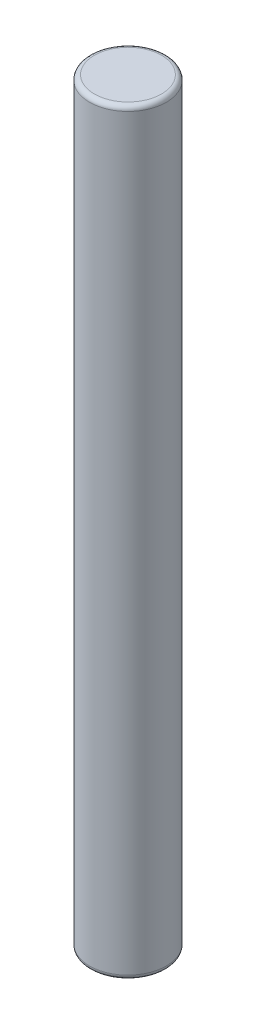
ISO-10303-21;
HEADER;
FILE_DESCRIPTION(('STEP AP214'),'2;1');
FILE_NAME('part.step','',(''),(''),'','','');
FILE_SCHEMA(('AUTOMOTIVE_DESIGN { 1 0 10303 214 1 1 1 1 }'));
ENDSEC;
DATA;
#1=APPLICATION_CONTEXT('core data for automotive mechanical design processes');
#2=APPLICATION_PROTOCOL_DEFINITION('international standard','automotive_design',2000,#1);
#3=PRODUCT_CONTEXT('',#1,'mechanical');
#4=PRODUCT('Part','Part','',(#3));
#5=PRODUCT_RELATED_PRODUCT_CATEGORY('part','',(#4));
#6=PRODUCT_DEFINITION_FORMATION('','',#4);
#7=PRODUCT_DEFINITION_CONTEXT('part definition',#1,'design');
#8=PRODUCT_DEFINITION('design','',#6,#7);
#9=PRODUCT_DEFINITION_SHAPE('','',#8);
#10=(LENGTH_UNIT() NAMED_UNIT(*) SI_UNIT(.MILLI.,.METRE.));
#11=(NAMED_UNIT(*) PLANE_ANGLE_UNIT() SI_UNIT($,.RADIAN.));
#12=(NAMED_UNIT(*) SI_UNIT($,.STERADIAN.) SOLID_ANGLE_UNIT());
#13=UNCERTAINTY_MEASURE_WITH_UNIT(LENGTH_MEASURE(1.E-05),#10,'distance_accuracy_value','');
#14=(GEOMETRIC_REPRESENTATION_CONTEXT(3) GLOBAL_UNCERTAINTY_ASSIGNED_CONTEXT((#13)) GLOBAL_UNIT_ASSIGNED_CONTEXT((#10,
#11,#12)) REPRESENTATION_CONTEXT('',''));
#15=CARTESIAN_POINT('',(0.,0.,0.));
#16=DIRECTION('',(0.,0.,1.));
#17=DIRECTION('',(1.,0.,0.));
#18=AXIS2_PLACEMENT_3D('',#15,#16,#17);
#19=CARTESIAN_POINT('',(0.,39.5,0.));
#20=DIRECTION('',(0.,-1.,0.));
#21=DIRECTION('',(0.,0.,-1.));
#22=AXIS2_PLACEMENT_3D('',#19,#20,#21);
#23=CYLINDRICAL_SURFACE('',#22,2.);
#24=CARTESIAN_POINT('',(0.,0.25,0.));
#25=DIRECTION('',(0.,1.,0.));
#26=DIRECTION('',(0.,0.,1.));
#27=AXIS2_PLACEMENT_3D('',#24,#25,#26);
#28=CIRCLE('',#27,2.);
#29=CARTESIAN_POINT('',(0.,0.25,2.));
#30=VERTEX_POINT('',#29);
#31=EDGE_CURVE('E42',#30,#30,#28,.T.);
#32=ORIENTED_EDGE('',*,*,#31,.T.);
#33=EDGE_LOOP('',(#32));
#34=FACE_BOUND('',#33,.T.);
#35=CARTESIAN_POINT('',(0.,39.25,0.));
#36=DIRECTION('',(0.,1.,0.));
#37=DIRECTION('',(0.,0.,1.));
#38=AXIS2_PLACEMENT_3D('',#35,#36,#37);
#39=CIRCLE('',#38,2.);
#40=CARTESIAN_POINT('',(0.,39.25,2.));
#41=VERTEX_POINT('',#40);
#42=EDGE_CURVE('E46',#41,#41,#39,.F.);
#43=ORIENTED_EDGE('',*,*,#42,.T.);
#44=EDGE_LOOP('',(#43));
#45=FACE_BOUND('',#44,.T.);
#46=ADVANCED_FACE('F31',(#34,#45),#23,.T.);
#47=CARTESIAN_POINT('',(0.,39.5,0.));
#48=DIRECTION('',(0.,1.,0.));
#49=DIRECTION('',(0.,0.,1.));
#50=AXIS2_PLACEMENT_3D('',#47,#48,#49);
#51=PLANE('',#50);
#52=CARTESIAN_POINT('',(0.,39.5,0.));
#53=DIRECTION('',(0.,1.,0.));
#54=DIRECTION('',(0.,0.,1.));
#55=AXIS2_PLACEMENT_3D('',#52,#53,#54);
#56=CIRCLE('',#55,1.75);
#57=CARTESIAN_POINT('',(0.,39.5,1.75));
#58=VERTEX_POINT('',#57);
#59=EDGE_CURVE('E10',#58,#58,#56,.T.);
#60=ORIENTED_EDGE('',*,*,#59,.T.);
#61=EDGE_LOOP('',(#60));
#62=FACE_BOUND('',#61,.T.);
#63=ADVANCED_FACE('F62',(#62),#51,.T.);
#64=CARTESIAN_POINT('',(0.,0.,0.));
#65=DIRECTION('',(0.,1.,0.));
#66=DIRECTION('',(0.,0.,1.));
#67=AXIS2_PLACEMENT_3D('',#64,#65,#66);
#68=PLANE('',#67);
#69=CARTESIAN_POINT('',(0.,0.,0.));
#70=DIRECTION('',(0.,1.,0.));
#71=DIRECTION('',(0.,0.,1.));
#72=AXIS2_PLACEMENT_3D('',#69,#70,#71);
#73=CIRCLE('',#72,1.75);
#74=CARTESIAN_POINT('',(0.,0.,1.75));
#75=VERTEX_POINT('',#74);
#76=EDGE_CURVE('E38',#75,#75,#73,.F.);
#77=ORIENTED_EDGE('',*,*,#76,.T.);
#78=EDGE_LOOP('',(#77));
#79=FACE_BOUND('',#78,.T.);
#80=ADVANCED_FACE('F59',(#79),#68,.F.);
#81=CARTESIAN_POINT('',(0.,0.25,0.));
#82=DIRECTION('',(0.,1.,0.));
#83=DIRECTION('',(0.,0.,1.));
#84=AXIS2_PLACEMENT_3D('',#81,#82,#83);
#85=TOROIDAL_SURFACE('',#84,1.75,0.25);
#86=ORIENTED_EDGE('',*,*,#76,.F.);
#87=EDGE_LOOP('',(#86));
#88=FACE_BOUND('',#87,.T.);
#89=ORIENTED_EDGE('',*,*,#31,.F.);
#90=EDGE_LOOP('',(#89));
#91=FACE_BOUND('',#90,.T.);
#92=ADVANCED_FACE('F55',(#88,#91),#85,.T.);
#93=CARTESIAN_POINT('',(0.,39.25,0.));
#94=DIRECTION('',(0.,1.,0.));
#95=DIRECTION('',(0.,0.,1.));
#96=AXIS2_PLACEMENT_3D('',#93,#94,#95);
#97=TOROIDAL_SURFACE('',#96,1.75,0.25);
#98=ORIENTED_EDGE('',*,*,#42,.F.);
#99=EDGE_LOOP('',(#98));
#100=FACE_BOUND('',#99,.T.);
#101=ORIENTED_EDGE('',*,*,#59,.F.);
#102=EDGE_LOOP('',(#101));
#103=FACE_BOUND('',#102,.T.);
#104=ADVANCED_FACE('F33',(#100,#103),#97,.T.);
#105=CLOSED_SHELL('',(#46,#63,#80,#92,#104));
#106=MANIFOLD_SOLID_BREP('B2',#105);
#107=ADVANCED_BREP_SHAPE_REPRESENTATION('',(#18,#106),#14);
#108=SHAPE_DEFINITION_REPRESENTATION(#9,#107);
ENDSEC;
END-ISO-10303-21;
